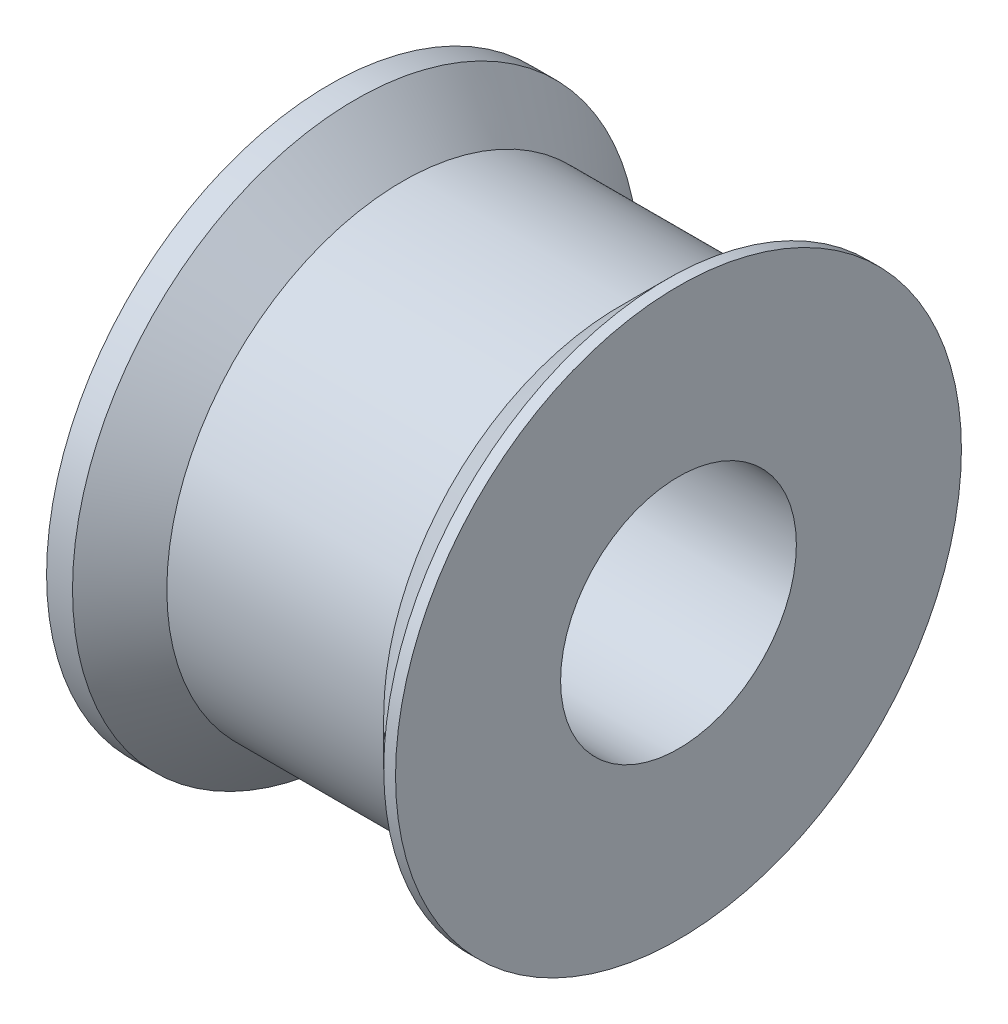
ISO-10303-21;
HEADER;
FILE_DESCRIPTION(('STEP AP214'),'2;1');
FILE_NAME('part.step','',(''),(''),'','','');
FILE_SCHEMA(('AUTOMOTIVE_DESIGN { 1 0 10303 214 1 1 1 1 }'));
ENDSEC;
DATA;
#1=APPLICATION_CONTEXT('core data for automotive mechanical design processes');
#2=APPLICATION_PROTOCOL_DEFINITION('international standard','automotive_design',2000,#1);
#3=PRODUCT_CONTEXT('',#1,'mechanical');
#4=PRODUCT('Part','Part','',(#3));
#5=PRODUCT_RELATED_PRODUCT_CATEGORY('part','',(#4));
#6=PRODUCT_DEFINITION_FORMATION('','',#4);
#7=PRODUCT_DEFINITION_CONTEXT('part definition',#1,'design');
#8=PRODUCT_DEFINITION('design','',#6,#7);
#9=PRODUCT_DEFINITION_SHAPE('','',#8);
#10=(LENGTH_UNIT() NAMED_UNIT(*) SI_UNIT(.MILLI.,.METRE.));
#11=(NAMED_UNIT(*) PLANE_ANGLE_UNIT() SI_UNIT($,.RADIAN.));
#12=(NAMED_UNIT(*) SI_UNIT($,.STERADIAN.) SOLID_ANGLE_UNIT());
#13=UNCERTAINTY_MEASURE_WITH_UNIT(LENGTH_MEASURE(1.E-05),#10,'distance_accuracy_value','');
#14=(GEOMETRIC_REPRESENTATION_CONTEXT(3) GLOBAL_UNCERTAINTY_ASSIGNED_CONTEXT((#13)) GLOBAL_UNIT_ASSIGNED_CONTEXT((#10,
#11,#12)) REPRESENTATION_CONTEXT('',''));
#15=CARTESIAN_POINT('',(0.,0.,0.));
#16=DIRECTION('',(0.,0.,1.));
#17=DIRECTION('',(1.,0.,0.));
#18=AXIS2_PLACEMENT_3D('',#15,#16,#17);
#19=CARTESIAN_POINT('',(-7.7,0.,0.));
#20=DIRECTION('',(-1.,0.,0.));
#21=DIRECTION('',(0.,0.,1.));
#22=AXIS2_PLACEMENT_3D('',#19,#20,#21);
#23=PLANE('',#22);
#24=CARTESIAN_POINT('',(-7.7,0.,0.));
#25=DIRECTION('',(-1.,0.,0.));
#26=DIRECTION('',(0.,0.,1.));
#27=AXIS2_PLACEMENT_3D('',#24,#25,#26);
#28=CIRCLE('',#27,3.1);
#29=CARTESIAN_POINT('',(-7.7,0.,3.1));
#30=VERTEX_POINT('',#29);
#31=EDGE_CURVE('E57',#30,#30,#28,.T.);
#32=ORIENTED_EDGE('',*,*,#31,.F.);
#33=EDGE_LOOP('',(#32));
#34=FACE_BOUND('',#33,.T.);
#35=CARTESIAN_POINT('',(-7.7,0.,0.));
#36=DIRECTION('',(1.,0.,0.));
#37=DIRECTION('',(0.,0.,-1.));
#38=AXIS2_PLACEMENT_3D('',#35,#36,#37);
#39=CIRCLE('',#38,12.);
#40=CARTESIAN_POINT('',(-7.7,0.,-12.));
#41=VERTEX_POINT('',#40);
#42=EDGE_CURVE('E10',#41,#41,#39,.T.);
#43=ORIENTED_EDGE('',*,*,#42,.F.);
#44=EDGE_LOOP('',(#43));
#45=FACE_BOUND('',#44,.T.);
#46=ADVANCED_FACE('F32',(#34,#45),#23,.T.);
#47=CARTESIAN_POINT('',(7.1,0.,0.));
#48=DIRECTION('',(1.,0.,0.));
#49=DIRECTION('',(0.,0.,-1.));
#50=AXIS2_PLACEMENT_3D('',#47,#48,#49);
#51=CYLINDRICAL_SURFACE('',#50,12.);
#52=CARTESIAN_POINT('',(-6.60000000000001,0.,0.));
#53=DIRECTION('',(1.,0.,0.));
#54=DIRECTION('',(0.,0.,-1.));
#55=AXIS2_PLACEMENT_3D('',#52,#53,#54);
#56=CIRCLE('',#55,12.);
#57=CARTESIAN_POINT('',(-6.60000000000001,0.,-12.));
#58=VERTEX_POINT('',#57);
#59=EDGE_CURVE('E39',#58,#58,#56,.T.);
#60=ORIENTED_EDGE('',*,*,#59,.F.);
#61=EDGE_LOOP('',(#60));
#62=FACE_BOUND('',#61,.T.);
#63=ORIENTED_EDGE('',*,*,#42,.T.);
#64=EDGE_LOOP('',(#63));
#65=FACE_BOUND('',#64,.T.);
#66=ADVANCED_FACE('F85',(#62,#65),#51,.T.);
#67=CARTESIAN_POINT('',(-6.60000000000001,0.,0.));
#68=DIRECTION('',(-1.,0.,0.));
#69=DIRECTION('',(0.,0.,1.));
#70=AXIS2_PLACEMENT_3D('',#67,#68,#69);
#71=CONICAL_SURFACE('',#70,12.,0.785398163397445);
#72=CARTESIAN_POINT('',(-4.6,0.,0.));
#73=DIRECTION('',(1.,0.,0.));
#74=DIRECTION('',(0.,0.,-1.));
#75=AXIS2_PLACEMENT_3D('',#72,#73,#74);
#76=CIRCLE('',#75,9.99999999999999);
#77=CARTESIAN_POINT('',(-4.6,0.,-9.99999999999999));
#78=VERTEX_POINT('',#77);
#79=EDGE_CURVE('E43',#78,#78,#76,.T.);
#80=ORIENTED_EDGE('',*,*,#79,.F.);
#81=EDGE_LOOP('',(#80));
#82=FACE_BOUND('',#81,.T.);
#83=ORIENTED_EDGE('',*,*,#59,.T.);
#84=EDGE_LOOP('',(#83));
#85=FACE_BOUND('',#84,.T.);
#86=ADVANCED_FACE('F89',(#82,#85),#71,.T.);
#87=CARTESIAN_POINT('',(7.1,0.,0.));
#88=DIRECTION('',(1.,0.,0.));
#89=DIRECTION('',(0.,0.,-1.));
#90=AXIS2_PLACEMENT_3D('',#87,#88,#89);
#91=CYLINDRICAL_SURFACE('',#90,9.99999999999997);
#92=CARTESIAN_POINT('',(4.6,0.,0.));
#93=DIRECTION('',(1.,0.,0.));
#94=DIRECTION('',(0.,0.,-1.));
#95=AXIS2_PLACEMENT_3D('',#92,#93,#94);
#96=CIRCLE('',#95,9.99999999999994);
#97=CARTESIAN_POINT('',(4.6,0.,-9.99999999999994));
#98=VERTEX_POINT('',#97);
#99=EDGE_CURVE('E48',#98,#98,#96,.T.);
#100=ORIENTED_EDGE('',*,*,#99,.F.);
#101=EDGE_LOOP('',(#100));
#102=FACE_BOUND('',#101,.T.);
#103=ORIENTED_EDGE('',*,*,#79,.T.);
#104=EDGE_LOOP('',(#103));
#105=FACE_BOUND('',#104,.T.);
#106=ADVANCED_FACE('F94',(#102,#105),#91,.T.);
#107=CARTESIAN_POINT('',(4.6,0.,0.));
#108=DIRECTION('',(1.,0.,0.));
#109=DIRECTION('',(0.,0.,-1.));
#110=AXIS2_PLACEMENT_3D('',#107,#108,#109);
#111=CONICAL_SURFACE('',#110,9.99999999999994,0.785398163397458);
#112=CARTESIAN_POINT('',(6.60000000000001,0.,0.));
#113=DIRECTION('',(1.,0.,0.));
#114=DIRECTION('',(0.,0.,-1.));
#115=AXIS2_PLACEMENT_3D('',#112,#113,#114);
#116=CIRCLE('',#115,12.);
#117=CARTESIAN_POINT('',(6.60000000000001,0.,-12.));
#118=VERTEX_POINT('',#117);
#119=EDGE_CURVE('E51',#118,#118,#116,.T.);
#120=ORIENTED_EDGE('',*,*,#119,.F.);
#121=EDGE_LOOP('',(#120));
#122=FACE_BOUND('',#121,.T.);
#123=ORIENTED_EDGE('',*,*,#99,.T.);
#124=EDGE_LOOP('',(#123));
#125=FACE_BOUND('',#124,.T.);
#126=ADVANCED_FACE('F101',(#122,#125),#111,.T.);
#127=CARTESIAN_POINT('',(7.1,0.,0.));
#128=DIRECTION('',(1.,0.,0.));
#129=DIRECTION('',(0.,0.,-1.));
#130=AXIS2_PLACEMENT_3D('',#127,#128,#129);
#131=CYLINDRICAL_SURFACE('',#130,12.);
#132=CARTESIAN_POINT('',(7.10000000000001,0.,0.));
#133=DIRECTION('',(1.,0.,0.));
#134=DIRECTION('',(0.,0.,-1.));
#135=AXIS2_PLACEMENT_3D('',#132,#133,#134);
#136=CIRCLE('',#135,12.);
#137=CARTESIAN_POINT('',(7.10000000000001,0.,-12.));
#138=VERTEX_POINT('',#137);
#139=EDGE_CURVE('E54',#138,#138,#136,.T.);
#140=ORIENTED_EDGE('',*,*,#139,.F.);
#141=EDGE_LOOP('',(#140));
#142=FACE_BOUND('',#141,.T.);
#143=ORIENTED_EDGE('',*,*,#119,.T.);
#144=EDGE_LOOP('',(#143));
#145=FACE_BOUND('',#144,.T.);
#146=ADVANCED_FACE('F105',(#142,#145),#131,.T.);
#147=CARTESIAN_POINT('',(7.1,0.,0.));
#148=DIRECTION('',(-1.,0.,0.));
#149=DIRECTION('',(0.,0.,1.));
#150=AXIS2_PLACEMENT_3D('',#147,#148,#149);
#151=PLANE('',#150);
#152=CARTESIAN_POINT('',(7.1,-2.98372437868011E-13,6.45317133063372E-13));
#153=DIRECTION('',(-1.,0.,0.));
#154=DIRECTION('',(0.,0.,1.));
#155=AXIS2_PLACEMENT_3D('',#152,#153,#154);
#156=CIRCLE('',#155,5.00000000000003);
#157=CARTESIAN_POINT('',(7.1,-2.98372437868011E-13,5.00000000000067));
#158=VERTEX_POINT('',#157);
#159=EDGE_CURVE('E60',#158,#158,#156,.F.);
#160=ORIENTED_EDGE('',*,*,#159,.F.);
#161=EDGE_LOOP('',(#160));
#162=FACE_BOUND('',#161,.T.);
#163=ORIENTED_EDGE('',*,*,#139,.T.);
#164=EDGE_LOOP('',(#163));
#165=FACE_BOUND('',#164,.T.);
#166=ADVANCED_FACE('F79',(#162,#165),#151,.F.);
#167=CARTESIAN_POINT('',(15.8681240867132,0.,0.));
#168=DIRECTION('',(-1.,0.,0.));
#169=DIRECTION('',(0.,0.,1.));
#170=AXIS2_PLACEMENT_3D('',#167,#168,#169);
#171=CYLINDRICAL_SURFACE('',#170,3.1);
#172=CARTESIAN_POINT('',(-5.7,0.,0.));
#173=DIRECTION('',(-1.,0.,0.));
#174=DIRECTION('',(0.,0.,1.));
#175=AXIS2_PLACEMENT_3D('',#172,#173,#174);
#176=CIRCLE('',#175,3.1);
#177=CARTESIAN_POINT('',(-5.7,0.,3.1));
#178=VERTEX_POINT('',#177);
#179=EDGE_CURVE('E35',#178,#178,#176,.F.);
#180=ORIENTED_EDGE('',*,*,#179,.T.);
#181=EDGE_LOOP('',(#180));
#182=FACE_BOUND('',#181,.T.);
#183=ORIENTED_EDGE('',*,*,#31,.T.);
#184=EDGE_LOOP('',(#183));
#185=FACE_BOUND('',#184,.T.);
#186=ADVANCED_FACE('F72',(#182,#185),#171,.F.);
#187=CARTESIAN_POINT('',(-5.7,-2.98372437868011E-13,6.45317133063372E-13));
#188=DIRECTION('',(-1.,0.,0.));
#189=DIRECTION('',(0.,0.,1.));
#190=AXIS2_PLACEMENT_3D('',#187,#188,#189);
#191=PLANE('',#190);
#192=CARTESIAN_POINT('',(-5.7,-2.98372437868011E-13,6.45317133063372E-13));
#193=DIRECTION('',(-1.,0.,0.));
#194=DIRECTION('',(0.,0.,1.));
#195=AXIS2_PLACEMENT_3D('',#192,#193,#194);
#196=CIRCLE('',#195,5.00000000000003);
#197=CARTESIAN_POINT('',(-5.7,-2.98372437868011E-13,5.00000000000067));
#198=VERTEX_POINT('',#197);
#199=EDGE_CURVE('E63',#198,#198,#196,.T.);
#200=ORIENTED_EDGE('',*,*,#199,.F.);
#201=EDGE_LOOP('',(#200));
#202=FACE_BOUND('',#201,.T.);
#203=ORIENTED_EDGE('',*,*,#179,.F.);
#204=EDGE_LOOP('',(#203));
#205=FACE_BOUND('',#204,.T.);
#206=ADVANCED_FACE('F69',(#202,#205),#191,.F.);
#207=CARTESIAN_POINT('',(21.242135623731,-2.98372437868011E-13,6.45317133063372E-13));
#208=DIRECTION('',(-1.,0.,0.));
#209=DIRECTION('',(0.,0.,1.));
#210=AXIS2_PLACEMENT_3D('',#207,#208,#209);
#211=CYLINDRICAL_SURFACE('',#210,5.00000000000003);
#212=CARTESIAN_POINT('',(7.1,-2.98372437868011E-13,5.00000000000067));
#213=CARTESIAN_POINT('',(6.96666666666667,-2.98372437868011E-13,5.00000000000067));
#214=CARTESIAN_POINT('',(6.83333333333334,-2.98372437868011E-13,5.00000000000067));
#215=CARTESIAN_POINT('',(6.56666666666667,-2.98372437868011E-13,5.00000000000067));
#216=CARTESIAN_POINT('',(6.43333333333334,-2.98372437868011E-13,5.00000000000067));
#217=CARTESIAN_POINT('',(6.16666666666667,-2.98372437868011E-13,5.00000000000067));
#218=CARTESIAN_POINT('',(6.03333333333334,-2.98372437868011E-13,5.00000000000067));
#219=CARTESIAN_POINT('',(5.76666666666667,-2.98372437868011E-13,5.00000000000067));
#220=CARTESIAN_POINT('',(5.63333333333334,-2.98372437868011E-13,5.00000000000067));
#221=CARTESIAN_POINT('',(5.36666666666667,-2.98372437868011E-13,5.00000000000067));
#222=CARTESIAN_POINT('',(5.23333333333334,-2.98372437868011E-13,5.00000000000067));
#223=CARTESIAN_POINT('',(4.96666666666667,-2.98372437868011E-13,5.00000000000067));
#224=CARTESIAN_POINT('',(4.83333333333334,-2.98372437868011E-13,5.00000000000067));
#225=CARTESIAN_POINT('',(4.56666666666667,-2.98372437868011E-13,5.00000000000067));
#226=CARTESIAN_POINT('',(4.43333333333334,-2.98372437868011E-13,5.00000000000067));
#227=CARTESIAN_POINT('',(4.16666666666667,-2.98372437868011E-13,5.00000000000067));
#228=CARTESIAN_POINT('',(4.03333333333334,-2.98372437868011E-13,5.00000000000067));
#229=CARTESIAN_POINT('',(3.76666666666667,-2.98372437868011E-13,5.00000000000067));
#230=CARTESIAN_POINT('',(3.63333333333334,-2.98372437868011E-13,5.00000000000067));
#231=CARTESIAN_POINT('',(3.36666666666667,-2.98372437868011E-13,5.00000000000067));
#232=CARTESIAN_POINT('',(3.23333333333334,-2.98372437868011E-13,5.00000000000067));
#233=CARTESIAN_POINT('',(2.96666666666667,-2.98372437868011E-13,5.00000000000067));
#234=CARTESIAN_POINT('',(2.83333333333334,-2.98372437868011E-13,5.00000000000067));
#235=CARTESIAN_POINT('',(2.56666666666667,-2.98372437868011E-13,5.00000000000067));
#236=CARTESIAN_POINT('',(2.43333333333334,-2.98372437868011E-13,5.00000000000067));
#237=CARTESIAN_POINT('',(2.16666666666667,-2.98372437868011E-13,5.00000000000067));
#238=CARTESIAN_POINT('',(2.03333333333334,-2.98372437868011E-13,5.00000000000067));
#239=CARTESIAN_POINT('',(1.76666666666667,-2.98372437868011E-13,5.00000000000067));
#240=CARTESIAN_POINT('',(1.63333333333334,-2.98372437868011E-13,5.00000000000067));
#241=CARTESIAN_POINT('',(1.36666666666667,-2.98372437868011E-13,5.00000000000067));
#242=CARTESIAN_POINT('',(1.23333333333334,-2.98372437868011E-13,5.00000000000067));
#243=CARTESIAN_POINT('',(0.966666666666671,-2.98372437868011E-13,5.00000000000067));
#244=CARTESIAN_POINT('',(0.833333333333339,-2.98372437868011E-13,5.00000000000067));
#245=CARTESIAN_POINT('',(0.566666666666672,-2.98372437868011E-13,5.00000000000067));
#246=CARTESIAN_POINT('',(0.433333333333339,-2.98372437868011E-13,5.00000000000067));
#247=CARTESIAN_POINT('',(0.166666666666671,-2.98372437868011E-13,5.00000000000067));
#248=CARTESIAN_POINT('',(0.0333333333333377,-2.98372437868011E-13,5.00000000000067));
#249=CARTESIAN_POINT('',(-0.23333333333333,-2.98372437868011E-13,5.00000000000067));
#250=CARTESIAN_POINT('',(-0.366666666666663,-2.98372437868011E-13,5.00000000000067));
#251=CARTESIAN_POINT('',(-0.633333333333331,-2.98372437868011E-13,5.00000000000067));
#252=CARTESIAN_POINT('',(-0.766666666666664,-2.98372437868011E-13,5.00000000000067));
#253=CARTESIAN_POINT('',(-1.03333333333333,-2.98372437868011E-13,5.00000000000067));
#254=CARTESIAN_POINT('',(-1.16666666666666,-2.98372437868011E-13,5.00000000000067));
#255=CARTESIAN_POINT('',(-1.43333333333333,-2.98372437868011E-13,5.00000000000067));
#256=CARTESIAN_POINT('',(-1.56666666666666,-2.98372437868011E-13,5.00000000000067));
#257=CARTESIAN_POINT('',(-1.83333333333333,-2.98372437868011E-13,5.00000000000067));
#258=CARTESIAN_POINT('',(-1.96666666666666,-2.98372437868011E-13,5.00000000000067));
#259=CARTESIAN_POINT('',(-2.23333333333333,-2.98372437868011E-13,5.00000000000067));
#260=CARTESIAN_POINT('',(-2.36666666666666,-2.98372437868011E-13,5.00000000000067));
#261=CARTESIAN_POINT('',(-2.63333333333333,-2.98372437868011E-13,5.00000000000067));
#262=CARTESIAN_POINT('',(-2.76666666666666,-2.98372437868011E-13,5.00000000000067));
#263=CARTESIAN_POINT('',(-3.03333333333333,-2.98372437868011E-13,5.00000000000067));
#264=CARTESIAN_POINT('',(-3.16666666666666,-2.98372437868011E-13,5.00000000000067));
#265=CARTESIAN_POINT('',(-3.43333333333333,-2.98372437868011E-13,5.00000000000067));
#266=CARTESIAN_POINT('',(-3.56666666666666,-2.98372437868011E-13,5.00000000000067));
#267=CARTESIAN_POINT('',(-3.83333333333333,-2.98372437868011E-13,5.00000000000067));
#268=CARTESIAN_POINT('',(-3.96666666666666,-2.98372437868011E-13,5.00000000000067));
#269=CARTESIAN_POINT('',(-4.23333333333333,-2.98372437868011E-13,5.00000000000067));
#270=CARTESIAN_POINT('',(-4.36666666666666,-2.98372437868011E-13,5.00000000000067));
#271=CARTESIAN_POINT('',(-4.63333333333333,-2.98372437868011E-13,5.00000000000067));
#272=CARTESIAN_POINT('',(-4.76666666666666,-2.98372437868011E-13,5.00000000000067));
#273=CARTESIAN_POINT('',(-5.03333333333333,-2.98372437868011E-13,5.00000000000067));
#274=CARTESIAN_POINT('',(-5.16666666666666,-2.98372437868011E-13,5.00000000000067));
#275=CARTESIAN_POINT('',(-5.43333333333333,-2.98372437868011E-13,5.00000000000067));
#276=CARTESIAN_POINT('',(-5.56666666666666,-2.98372437868011E-13,5.00000000000067));
#277=CARTESIAN_POINT('',(-5.7,-2.98372437868011E-13,5.00000000000067));
#278=B_SPLINE_CURVE_WITH_KNOTS('',3,(#212,#213,#214,#215,#216,#217,#218,#219,#220,#221,#222,
#223,#224,#225,#226,#227,#228,#229,#230,#231,#232,#233,#234,#235,#236,#237,#238,#239,#240,#241,
#242,#243,#244,#245,#246,#247,#248,#249,#250,#251,#252,#253,#254,#255,#256,#257,#258,#259,#260,
#261,#262,#263,#264,#265,#266,#267,#268,#269,#270,#271,#272,#273,#274,#275,#276,#277),
.UNSPECIFIED.,.F.,.F.,(4,2,2,2,2,2,2,2,2,2,2,2,2,2,2,2,2,2,2,2,2,2,2,2,2,2,2,2,2,2,2,2,4),(0.,
0.399999999999999,0.8,1.2,1.6,2.,2.4,2.8,3.2,3.6,4.,4.4,4.8,5.2,5.6,6.,6.4,6.8,7.2,7.6,8.,8.4,
8.8,9.2,9.6,10.,10.4,10.8,11.2,11.6,12.,12.4,12.8),.UNSPECIFIED.);
#279=EDGE_CURVE('BSEAM67',#158,#198,#278,.T.);
#280=ORIENTED_EDGE('',*,*,#159,.T.);
#281=ORIENTED_EDGE('',*,*,#199,.T.);
#282=ORIENTED_EDGE('',*,*,#279,.T.);
#283=ORIENTED_EDGE('',*,*,#279,.F.);
#284=EDGE_LOOP('',(#280,#282,#281,#283));
#285=FACE_BOUND('',#284,.T.);
#286=ADVANCED_FACE('F67',(#285),#211,.F.);
#287=CLOSED_SHELL('',(#46,#66,#86,#106,#126,#146,#166,#186,#206,#286));
#288=MANIFOLD_SOLID_BREP('B2',#287);
#289=ADVANCED_BREP_SHAPE_REPRESENTATION('',(#18,#288),#14);
#290=SHAPE_DEFINITION_REPRESENTATION(#9,#289);
ENDSEC;
END-ISO-10303-21;
